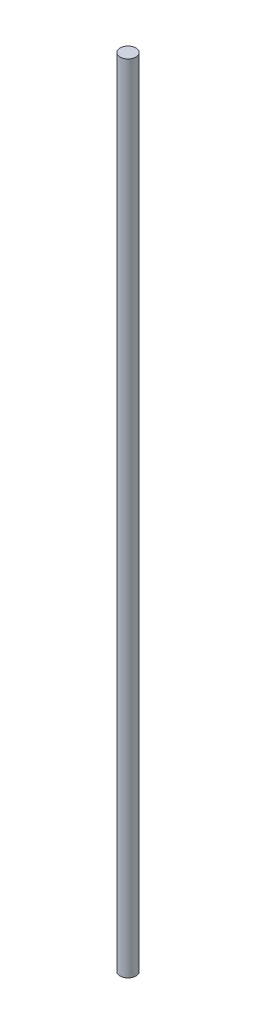
ISO-10303-21;
HEADER;
FILE_DESCRIPTION(('STEP AP214'),'2;1');
FILE_NAME('part.step','',(''),(''),'','','');
FILE_SCHEMA(('AUTOMOTIVE_DESIGN { 1 0 10303 214 1 1 1 1 }'));
ENDSEC;
DATA;
#1=APPLICATION_CONTEXT('core data for automotive mechanical design processes');
#2=APPLICATION_PROTOCOL_DEFINITION('international standard','automotive_design',2000,#1);
#3=PRODUCT_CONTEXT('',#1,'mechanical');
#4=PRODUCT('Part','Part','',(#3));
#5=PRODUCT_RELATED_PRODUCT_CATEGORY('part','',(#4));
#6=PRODUCT_DEFINITION_FORMATION('','',#4);
#7=PRODUCT_DEFINITION_CONTEXT('part definition',#1,'design');
#8=PRODUCT_DEFINITION('design','',#6,#7);
#9=PRODUCT_DEFINITION_SHAPE('','',#8);
#10=(LENGTH_UNIT() NAMED_UNIT(*) SI_UNIT(.MILLI.,.METRE.));
#11=(NAMED_UNIT(*) PLANE_ANGLE_UNIT() SI_UNIT($,.RADIAN.));
#12=(NAMED_UNIT(*) SI_UNIT($,.STERADIAN.) SOLID_ANGLE_UNIT());
#13=UNCERTAINTY_MEASURE_WITH_UNIT(LENGTH_MEASURE(1.E-05),#10,'distance_accuracy_value','');
#14=(GEOMETRIC_REPRESENTATION_CONTEXT(3) GLOBAL_UNCERTAINTY_ASSIGNED_CONTEXT((#13)) GLOBAL_UNIT_ASSIGNED_CONTEXT((#10,
#11,#12)) REPRESENTATION_CONTEXT('',''));
#15=CARTESIAN_POINT('',(0.,0.,0.));
#16=DIRECTION('',(0.,0.,1.));
#17=DIRECTION('',(1.,0.,0.));
#18=AXIS2_PLACEMENT_3D('',#15,#16,#17);
#19=CARTESIAN_POINT('',(0.,100.,0.));
#20=DIRECTION('',(0.,-1.,0.));
#21=DIRECTION('',(0.,0.,-1.));
#22=AXIS2_PLACEMENT_3D('',#19,#20,#21);
#23=CYLINDRICAL_SURFACE('',#22,1.);
#24=CARTESIAN_POINT('',(0.,100.,0.));
#25=DIRECTION('',(0.,1.,0.));
#26=DIRECTION('',(0.,0.,1.));
#27=AXIS2_PLACEMENT_3D('',#24,#25,#26);
#28=CIRCLE('',#27,1.);
#29=CARTESIAN_POINT('',(0.,100.,1.));
#30=VERTEX_POINT('',#29);
#31=EDGE_CURVE('E10',#30,#30,#28,.T.);
#32=ORIENTED_EDGE('',*,*,#31,.F.);
#33=EDGE_LOOP('',(#32));
#34=FACE_BOUND('',#33,.T.);
#35=CARTESIAN_POINT('',(0.,0.,0.));
#36=DIRECTION('',(0.,1.,0.));
#37=DIRECTION('',(0.,0.,1.));
#38=AXIS2_PLACEMENT_3D('',#35,#36,#37);
#39=CIRCLE('',#38,1.);
#40=CARTESIAN_POINT('',(0.,0.,1.));
#41=VERTEX_POINT('',#40);
#42=EDGE_CURVE('E37',#41,#41,#39,.T.);
#43=ORIENTED_EDGE('',*,*,#42,.T.);
#44=EDGE_LOOP('',(#43));
#45=FACE_BOUND('',#44,.T.);
#46=ADVANCED_FACE('F34',(#34,#45),#23,.T.);
#47=CARTESIAN_POINT('',(0.,100.,0.));
#48=DIRECTION('',(0.,1.,0.));
#49=DIRECTION('',(0.,0.,1.));
#50=AXIS2_PLACEMENT_3D('',#47,#48,#49);
#51=PLANE('',#50);
#52=ORIENTED_EDGE('',*,*,#31,.T.);
#53=EDGE_LOOP('',(#52));
#54=FACE_BOUND('',#53,.T.);
#55=ADVANCED_FACE('F49',(#54),#51,.T.);
#56=CARTESIAN_POINT('',(0.,0.,0.));
#57=DIRECTION('',(0.,1.,0.));
#58=DIRECTION('',(0.,0.,1.));
#59=AXIS2_PLACEMENT_3D('',#56,#57,#58);
#60=PLANE('',#59);
#61=ORIENTED_EDGE('',*,*,#42,.F.);
#62=EDGE_LOOP('',(#61));
#63=FACE_BOUND('',#62,.T.);
#64=ADVANCED_FACE('F47',(#63),#60,.F.);
#65=CLOSED_SHELL('',(#46,#55,#64));
#66=MANIFOLD_SOLID_BREP('B2',#65);
#67=ADVANCED_BREP_SHAPE_REPRESENTATION('',(#18,#66),#14);
#68=SHAPE_DEFINITION_REPRESENTATION(#9,#67);
ENDSEC;
END-ISO-10303-21;
